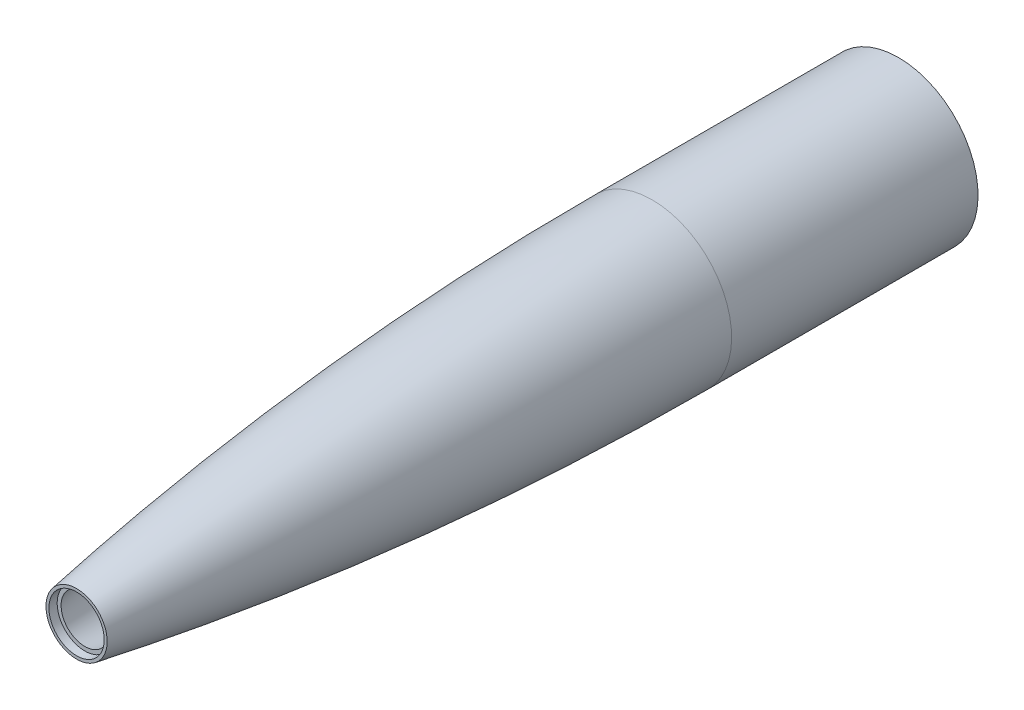
ISO-10303-21;
HEADER;
FILE_DESCRIPTION(('STEP AP214'),'2;1');
FILE_NAME('part.step','',(''),(''),'','','');
FILE_SCHEMA(('AUTOMOTIVE_DESIGN { 1 0 10303 214 1 1 1 1 }'));
ENDSEC;
DATA;
#1=APPLICATION_CONTEXT('core data for automotive mechanical design processes');
#2=APPLICATION_PROTOCOL_DEFINITION('international standard','automotive_design',2000,#1);
#3=PRODUCT_CONTEXT('',#1,'mechanical');
#4=PRODUCT('Part','Part','',(#3));
#5=PRODUCT_RELATED_PRODUCT_CATEGORY('part','',(#4));
#6=PRODUCT_DEFINITION_FORMATION('','',#4);
#7=PRODUCT_DEFINITION_CONTEXT('part definition',#1,'design');
#8=PRODUCT_DEFINITION('design','',#6,#7);
#9=PRODUCT_DEFINITION_SHAPE('','',#8);
#10=(LENGTH_UNIT() NAMED_UNIT(*) SI_UNIT(.MILLI.,.METRE.));
#11=(NAMED_UNIT(*) PLANE_ANGLE_UNIT() SI_UNIT($,.RADIAN.));
#12=(NAMED_UNIT(*) SI_UNIT($,.STERADIAN.) SOLID_ANGLE_UNIT());
#13=UNCERTAINTY_MEASURE_WITH_UNIT(LENGTH_MEASURE(1.E-05),#10,'distance_accuracy_value','');
#14=(GEOMETRIC_REPRESENTATION_CONTEXT(3) GLOBAL_UNCERTAINTY_ASSIGNED_CONTEXT((#13)) GLOBAL_UNIT_ASSIGNED_CONTEXT((#10,
#11,#12)) REPRESENTATION_CONTEXT('',''));
#15=CARTESIAN_POINT('',(0.,0.,0.));
#16=DIRECTION('',(0.,0.,1.));
#17=DIRECTION('',(1.,0.,0.));
#18=AXIS2_PLACEMENT_3D('',#15,#16,#17);
#19=CARTESIAN_POINT('',(0.,20.28,0.));
#20=DIRECTION('',(0.,0.,-1.));
#21=DIRECTION('',(0.,1.,0.));
#22=AXIS2_PLACEMENT_3D('',#19,#20,#21);
#23=PLANE('',#22);
#24=CARTESIAN_POINT('',(0.,0.,0.));
#25=DIRECTION('',(0.,0.,-1.));
#26=DIRECTION('',(0.,1.,0.));
#27=AXIS2_PLACEMENT_3D('',#24,#25,#26);
#28=CIRCLE('',#27,20.28);
#29=CARTESIAN_POINT('',(0.,20.28,0.));
#30=VERTEX_POINT('',#29);
#31=EDGE_CURVE('E69',#30,#30,#28,.T.);
#32=ORIENTED_EDGE('',*,*,#31,.T.);
#33=EDGE_LOOP('',(#32));
#34=FACE_BOUND('',#33,.T.);
#35=CARTESIAN_POINT('',(0.,0.,0.));
#36=DIRECTION('',(0.,0.,-1.));
#37=DIRECTION('',(0.,1.,0.));
#38=AXIS2_PLACEMENT_3D('',#35,#36,#37);
#39=CIRCLE('',#38,19.28);
#40=CARTESIAN_POINT('',(0.,19.28,0.));
#41=VERTEX_POINT('',#40);
#42=EDGE_CURVE('E10',#41,#41,#39,.T.);
#43=ORIENTED_EDGE('',*,*,#42,.F.);
#44=EDGE_LOOP('',(#43));
#45=FACE_BOUND('',#44,.T.);
#46=ADVANCED_FACE('F41',(#34,#45),#23,.T.);
#47=CARTESIAN_POINT('',(0.,0.,0.));
#48=DIRECTION('',(0.,0.,-1.));
#49=DIRECTION('',(0.,1.,0.));
#50=AXIS2_PLACEMENT_3D('',#47,#48,#49);
#51=CYLINDRICAL_SURFACE('',#50,19.28);
#52=ORIENTED_EDGE('',*,*,#42,.T.);
#53=EDGE_LOOP('',(#52));
#54=FACE_BOUND('',#53,.T.);
#55=CARTESIAN_POINT('',(0.,0.,62.82));
#56=DIRECTION('',(0.,0.,-1.));
#57=DIRECTION('',(0.,1.,0.));
#58=AXIS2_PLACEMENT_3D('',#55,#56,#57);
#59=CIRCLE('',#58,19.28);
#60=CARTESIAN_POINT('',(0.,19.28,62.82));
#61=VERTEX_POINT('',#60);
#62=EDGE_CURVE('E47',#61,#61,#59,.T.);
#63=ORIENTED_EDGE('',*,*,#62,.F.);
#64=EDGE_LOOP('',(#63));
#65=FACE_BOUND('',#64,.T.);
#66=ADVANCED_FACE('F87',(#54,#65),#51,.F.);
#67=CARTESIAN_POINT('',(0.,0.,62.8200000000001));
#68=DIRECTION('',(0.,0.,-1.));
#69=DIRECTION('',(0.,1.,0.));
#70=AXIS2_PLACEMENT_3D('',#67,#68,#69);
#71=DEGENERATE_TOROIDAL_SURFACE('',#70,777.880612244898,797.160612244898,.F.);
#72=ORIENTED_EDGE('',*,*,#62,.T.);
#73=EDGE_LOOP('',(#72));
#74=FACE_BOUND('',#73,.T.);
#75=CARTESIAN_POINT('',(0.,0.,207.45));
#76=DIRECTION('',(0.,0.,-1.));
#77=DIRECTION('',(0.,1.,0.));
#78=AXIS2_PLACEMENT_3D('',#75,#76,#77);
#79=CIRCLE('',#78,6.05);
#80=CARTESIAN_POINT('',(0.,6.04999999999997,207.45));
#81=VERTEX_POINT('',#80);
#82=EDGE_CURVE('E51',#81,#81,#79,.T.);
#83=ORIENTED_EDGE('',*,*,#82,.F.);
#84=EDGE_LOOP('',(#83));
#85=FACE_BOUND('',#84,.T.);
#86=ADVANCED_FACE('F91',(#74,#85),#71,.T.);
#87=CARTESIAN_POINT('',(0.,7.04999999999997,207.45));
#88=DIRECTION('',(0.,0.,1.));
#89=DIRECTION('',(0.,-1.,0.));
#90=AXIS2_PLACEMENT_3D('',#87,#88,#89);
#91=PLANE('',#90);
#92=ORIENTED_EDGE('',*,*,#82,.T.);
#93=EDGE_LOOP('',(#92));
#94=FACE_BOUND('',#93,.T.);
#95=CARTESIAN_POINT('',(0.,0.,207.45));
#96=DIRECTION('',(0.,0.,-1.));
#97=DIRECTION('',(0.,1.,0.));
#98=AXIS2_PLACEMENT_3D('',#95,#96,#97);
#99=CIRCLE('',#98,7.05);
#100=CARTESIAN_POINT('',(0.,7.04999999999997,207.45));
#101=VERTEX_POINT('',#100);
#102=EDGE_CURVE('E55',#101,#101,#99,.T.);
#103=ORIENTED_EDGE('',*,*,#102,.F.);
#104=EDGE_LOOP('',(#103));
#105=FACE_BOUND('',#104,.T.);
#106=ADVANCED_FACE('F95',(#94,#105),#91,.T.);
#107=CARTESIAN_POINT('',(0.,0.,0.));
#108=DIRECTION('',(0.,0.,-1.));
#109=DIRECTION('',(0.,1.,0.));
#110=AXIS2_PLACEMENT_3D('',#107,#108,#109);
#111=CYLINDRICAL_SURFACE('',#110,7.05);
#112=ORIENTED_EDGE('',*,*,#102,.T.);
#113=EDGE_LOOP('',(#112));
#114=FACE_BOUND('',#113,.T.);
#115=CARTESIAN_POINT('',(0.,0.,209.55));
#116=DIRECTION('',(0.,0.,-1.));
#117=DIRECTION('',(0.,1.,0.));
#118=AXIS2_PLACEMENT_3D('',#115,#116,#117);
#119=CIRCLE('',#118,7.05);
#120=CARTESIAN_POINT('',(0.,7.04999999999997,209.55));
#121=VERTEX_POINT('',#120);
#122=EDGE_CURVE('E60',#121,#121,#119,.T.);
#123=ORIENTED_EDGE('',*,*,#122,.F.);
#124=EDGE_LOOP('',(#123));
#125=FACE_BOUND('',#124,.T.);
#126=ADVANCED_FACE('F101',(#114,#125),#111,.F.);
#127=CARTESIAN_POINT('',(0.,7.79999999999997,209.55));
#128=DIRECTION('',(0.,0.,1.));
#129=DIRECTION('',(0.,-1.,0.));
#130=AXIS2_PLACEMENT_3D('',#127,#128,#129);
#131=PLANE('',#130);
#132=ORIENTED_EDGE('',*,*,#122,.T.);
#133=EDGE_LOOP('',(#132));
#134=FACE_BOUND('',#133,.T.);
#135=CARTESIAN_POINT('',(0.,0.,209.55));
#136=DIRECTION('',(0.,0.,-1.));
#137=DIRECTION('',(0.,1.,0.));
#138=AXIS2_PLACEMENT_3D('',#135,#136,#137);
#139=CIRCLE('',#138,7.80000000000005);
#140=CARTESIAN_POINT('',(0.,7.80000000000003,209.55));
#141=VERTEX_POINT('',#140);
#142=EDGE_CURVE('E63',#141,#141,#139,.T.);
#143=ORIENTED_EDGE('',*,*,#142,.F.);
#144=EDGE_LOOP('',(#143));
#145=FACE_BOUND('',#144,.T.);
#146=ADVANCED_FACE('F83',(#134,#145),#131,.T.);
#147=CARTESIAN_POINT('',(0.,0.,62.8200000000001));
#148=DIRECTION('',(0.,0.,-1.));
#149=DIRECTION('',(0.,1.,0.));
#150=AXIS2_PLACEMENT_3D('',#147,#148,#149);
#151=DEGENERATE_TOROIDAL_SURFACE('',#150,848.52782451923,868.80782451923,.F.);
#152=ORIENTED_EDGE('',*,*,#142,.T.);
#153=EDGE_LOOP('',(#152));
#154=FACE_BOUND('',#153,.T.);
#155=CARTESIAN_POINT('',(0.,0.,62.82));
#156=DIRECTION('',(0.,0.,-1.));
#157=DIRECTION('',(0.,1.,0.));
#158=AXIS2_PLACEMENT_3D('',#155,#156,#157);
#159=CIRCLE('',#158,20.28);
#160=CARTESIAN_POINT('',(0.,20.28,62.82));
#161=VERTEX_POINT('',#160);
#162=EDGE_CURVE('E66',#161,#161,#159,.T.);
#163=ORIENTED_EDGE('',*,*,#162,.F.);
#164=EDGE_LOOP('',(#163));
#165=FACE_BOUND('',#164,.T.);
#166=ADVANCED_FACE('F77',(#154,#165),#151,.F.);
#167=CARTESIAN_POINT('',(0.,0.,0.));
#168=DIRECTION('',(0.,0.,-1.));
#169=DIRECTION('',(0.,1.,0.));
#170=AXIS2_PLACEMENT_3D('',#167,#168,#169);
#171=CYLINDRICAL_SURFACE('',#170,20.28);
#172=ORIENTED_EDGE('',*,*,#162,.T.);
#173=EDGE_LOOP('',(#172));
#174=FACE_BOUND('',#173,.T.);
#175=ORIENTED_EDGE('',*,*,#31,.F.);
#176=EDGE_LOOP('',(#175));
#177=FACE_BOUND('',#176,.T.);
#178=ADVANCED_FACE('F75',(#174,#177),#171,.T.);
#179=CLOSED_SHELL('',(#46,#66,#86,#106,#126,#146,#166,#178));
#180=MANIFOLD_SOLID_BREP('B2',#179);
#181=ADVANCED_BREP_SHAPE_REPRESENTATION('',(#18,#180),#14);
#182=SHAPE_DEFINITION_REPRESENTATION(#9,#181);
ENDSEC;
END-ISO-10303-21;
